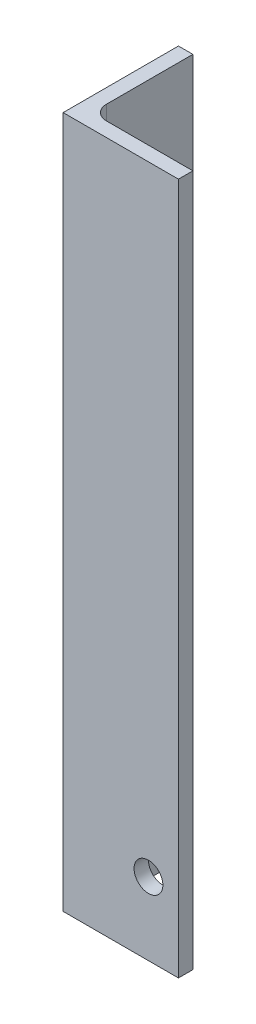
ISO-10303-21;
HEADER;
FILE_DESCRIPTION(('STEP AP214'),'2;1');
FILE_NAME('part.step','',(''),(''),'','','');
FILE_SCHEMA(('AUTOMOTIVE_DESIGN { 1 0 10303 214 1 1 1 1 }'));
ENDSEC;
DATA;
#1=APPLICATION_CONTEXT('core data for automotive mechanical design processes');
#2=APPLICATION_PROTOCOL_DEFINITION('international standard','automotive_design',2000,#1);
#3=PRODUCT_CONTEXT('',#1,'mechanical');
#4=PRODUCT('Part','Part','',(#3));
#5=PRODUCT_RELATED_PRODUCT_CATEGORY('part','',(#4));
#6=PRODUCT_DEFINITION_FORMATION('','',#4);
#7=PRODUCT_DEFINITION_CONTEXT('part definition',#1,'design');
#8=PRODUCT_DEFINITION('design','',#6,#7);
#9=PRODUCT_DEFINITION_SHAPE('','',#8);
#10=(LENGTH_UNIT() NAMED_UNIT(*) SI_UNIT(.MILLI.,.METRE.));
#11=(NAMED_UNIT(*) PLANE_ANGLE_UNIT() SI_UNIT($,.RADIAN.));
#12=(NAMED_UNIT(*) SI_UNIT($,.STERADIAN.) SOLID_ANGLE_UNIT());
#13=UNCERTAINTY_MEASURE_WITH_UNIT(LENGTH_MEASURE(1.E-05),#10,'distance_accuracy_value','');
#14=(GEOMETRIC_REPRESENTATION_CONTEXT(3) GLOBAL_UNCERTAINTY_ASSIGNED_CONTEXT((#13)) GLOBAL_UNIT_ASSIGNED_CONTEXT((#10,
#11,#12)) REPRESENTATION_CONTEXT('',''));
#15=CARTESIAN_POINT('',(0.,0.,0.));
#16=DIRECTION('',(0.,0.,1.));
#17=DIRECTION('',(1.,0.,0.));
#18=AXIS2_PLACEMENT_3D('',#15,#16,#17);
#19=CARTESIAN_POINT('',(3.175,152.4,0.));
#20=DIRECTION('',(0.,0.,1.));
#21=DIRECTION('',(1.,0.,0.));
#22=AXIS2_PLACEMENT_3D('',#19,#20,#21);
#23=PLANE('',#22);
#24=DIRECTION('',(-1.,0.,0.));
#25=VECTOR('',#24,1.);
#26=CARTESIAN_POINT('',(3.175,0.,0.));
#27=LINE('',#26,#25);
#28=CARTESIAN_POINT('',(3.175,0.,0.));
#29=VERTEX_POINT('',#28);
#30=CARTESIAN_POINT('',(0.,0.,0.));
#31=VERTEX_POINT('',#30);
#32=EDGE_CURVE('E122',#29,#31,#27,.T.);
#33=ORIENTED_EDGE('',*,*,#32,.T.);
#34=DIRECTION('',(0.,-1.,0.));
#35=VECTOR('',#34,1.);
#36=CARTESIAN_POINT('',(0.,152.4,0.));
#37=LINE('',#36,#35);
#38=CARTESIAN_POINT('',(0.,152.4,0.));
#39=VERTEX_POINT('',#38);
#40=EDGE_CURVE('E103',#39,#31,#37,.T.);
#41=ORIENTED_EDGE('',*,*,#40,.F.);
#42=DIRECTION('',(-1.,0.,0.));
#43=VECTOR('',#42,1.);
#44=CARTESIAN_POINT('',(3.175,152.4,0.));
#45=LINE('',#44,#43);
#46=CARTESIAN_POINT('',(3.175,152.4,0.));
#47=VERTEX_POINT('',#46);
#48=EDGE_CURVE('E110',#47,#39,#45,.T.);
#49=ORIENTED_EDGE('',*,*,#48,.F.);
#50=DIRECTION('',(0.,-1.,0.));
#51=VECTOR('',#50,1.);
#52=CARTESIAN_POINT('',(3.175,152.4,0.));
#53=LINE('',#52,#51);
#54=EDGE_CURVE('E137',#47,#29,#53,.T.);
#55=ORIENTED_EDGE('',*,*,#54,.T.);
#56=EDGE_LOOP('',(#33,#41,#49,#55));
#57=FACE_BOUND('',#56,.T.);
#58=ADVANCED_FACE('F39',(#57),#23,.F.);
#59=CARTESIAN_POINT('',(0.,152.4,0.));
#60=DIRECTION('',(1.,0.,0.));
#61=DIRECTION('',(0.,0.,-1.));
#62=AXIS2_PLACEMENT_3D('',#59,#60,#61);
#63=PLANE('',#62);
#64=CARTESIAN_POINT('',(0.,15.875,6.60400000000002));
#65=DIRECTION('',(-1.,0.,0.));
#66=DIRECTION('',(0.,0.,1.));
#67=AXIS2_PLACEMENT_3D('',#64,#65,#66);
#68=CIRCLE('',#67,3.175);
#69=CARTESIAN_POINT('',(0.,15.875,9.77900000000002));
#70=VERTEX_POINT('',#69);
#71=EDGE_CURVE('E155',#70,#70,#68,.T.);
#72=ORIENTED_EDGE('',*,*,#71,.F.);
#73=EDGE_LOOP('',(#72));
#74=FACE_BOUND('',#73,.T.);
#75=DIRECTION('',(0.,0.,1.));
#76=VECTOR('',#75,1.);
#77=CARTESIAN_POINT('',(0.,0.,0.));
#78=LINE('',#77,#76);
#79=CARTESIAN_POINT('',(0.,0.,25.4));
#80=VERTEX_POINT('',#79);
#81=EDGE_CURVE('E146',#31,#80,#78,.T.);
#82=ORIENTED_EDGE('',*,*,#81,.T.);
#83=DIRECTION('',(0.,-1.,0.));
#84=VECTOR('',#83,1.);
#85=CARTESIAN_POINT('',(0.,152.4,25.4));
#86=LINE('',#85,#84);
#87=CARTESIAN_POINT('',(0.,152.4,25.4));
#88=VERTEX_POINT('',#87);
#89=EDGE_CURVE('E106',#88,#80,#86,.T.);
#90=ORIENTED_EDGE('',*,*,#89,.F.);
#91=DIRECTION('',(0.,0.,1.));
#92=VECTOR('',#91,1.);
#93=CARTESIAN_POINT('',(0.,152.4,0.));
#94=LINE('',#93,#92);
#95=EDGE_CURVE('E99',#39,#88,#94,.T.);
#96=ORIENTED_EDGE('',*,*,#95,.F.);
#97=ORIENTED_EDGE('',*,*,#40,.T.);
#98=EDGE_LOOP('',(#82,#90,#96,#97));
#99=FACE_BOUND('',#98,.T.);
#100=ADVANCED_FACE('F101',(#74,#99),#63,.F.);
#101=CARTESIAN_POINT('',(0.,152.4,25.4));
#102=DIRECTION('',(0.,0.,-1.));
#103=DIRECTION('',(-1.,0.,0.));
#104=AXIS2_PLACEMENT_3D('',#101,#102,#103);
#105=PLANE('',#104);
#106=CARTESIAN_POINT('',(18.796,16.002,25.4));
#107=DIRECTION('',(0.,0.,1.));
#108=DIRECTION('',(1.,0.,0.));
#109=AXIS2_PLACEMENT_3D('',#106,#107,#108);
#110=CIRCLE('',#109,3.175);
#111=CARTESIAN_POINT('',(21.971,16.002,25.4));
#112=VERTEX_POINT('',#111);
#113=EDGE_CURVE('E161',#112,#112,#110,.T.);
#114=ORIENTED_EDGE('',*,*,#113,.F.);
#115=EDGE_LOOP('',(#114));
#116=FACE_BOUND('',#115,.T.);
#117=DIRECTION('',(1.,0.,0.));
#118=VECTOR('',#117,1.);
#119=CARTESIAN_POINT('',(0.,0.,25.4));
#120=LINE('',#119,#118);
#121=CARTESIAN_POINT('',(25.4,0.,25.4));
#122=VERTEX_POINT('',#121);
#123=EDGE_CURVE('E144',#80,#122,#120,.T.);
#124=ORIENTED_EDGE('',*,*,#123,.T.);
#125=DIRECTION('',(0.,-1.,0.));
#126=VECTOR('',#125,1.);
#127=CARTESIAN_POINT('',(25.4,152.4,25.4));
#128=LINE('',#127,#126);
#129=CARTESIAN_POINT('',(25.4,152.4,25.4));
#130=VERTEX_POINT('',#129);
#131=EDGE_CURVE('E127',#130,#122,#128,.T.);
#132=ORIENTED_EDGE('',*,*,#131,.F.);
#133=DIRECTION('',(1.,0.,0.));
#134=VECTOR('',#133,1.);
#135=CARTESIAN_POINT('',(0.,152.4,25.4));
#136=LINE('',#135,#134);
#137=EDGE_CURVE('E109',#88,#130,#136,.T.);
#138=ORIENTED_EDGE('',*,*,#137,.F.);
#139=ORIENTED_EDGE('',*,*,#89,.T.);
#140=EDGE_LOOP('',(#124,#132,#138,#139));
#141=FACE_BOUND('',#140,.T.);
#142=ADVANCED_FACE('F168',(#116,#141),#105,.F.);
#143=CARTESIAN_POINT('',(25.4,152.4,25.4));
#144=DIRECTION('',(-1.,0.,0.));
#145=DIRECTION('',(0.,0.,1.));
#146=AXIS2_PLACEMENT_3D('',#143,#144,#145);
#147=PLANE('',#146);
#148=DIRECTION('',(0.,0.,-1.));
#149=VECTOR('',#148,1.);
#150=CARTESIAN_POINT('',(25.4,0.,25.4));
#151=LINE('',#150,#149);
#152=CARTESIAN_POINT('',(25.4,0.,22.225));
#153=VERTEX_POINT('',#152);
#154=EDGE_CURVE('E142',#122,#153,#151,.T.);
#155=ORIENTED_EDGE('',*,*,#154,.T.);
#156=DIRECTION('',(0.,-1.,0.));
#157=VECTOR('',#156,1.);
#158=CARTESIAN_POINT('',(25.4,152.4,22.225));
#159=LINE('',#158,#157);
#160=CARTESIAN_POINT('',(25.4,152.4,22.225));
#161=VERTEX_POINT('',#160);
#162=EDGE_CURVE('E134',#161,#153,#159,.T.);
#163=ORIENTED_EDGE('',*,*,#162,.F.);
#164=DIRECTION('',(0.,0.,-1.));
#165=VECTOR('',#164,1.);
#166=CARTESIAN_POINT('',(25.4,152.4,25.4));
#167=LINE('',#166,#165);
#168=EDGE_CURVE('E152',#130,#161,#167,.T.);
#169=ORIENTED_EDGE('',*,*,#168,.F.);
#170=ORIENTED_EDGE('',*,*,#131,.T.);
#171=EDGE_LOOP('',(#155,#163,#169,#170));
#172=FACE_BOUND('',#171,.T.);
#173=ADVANCED_FACE('F171',(#172),#147,.F.);
#174=CARTESIAN_POINT('',(25.4,152.4,22.225));
#175=DIRECTION('',(0.,0.,1.));
#176=DIRECTION('',(1.,0.,0.));
#177=AXIS2_PLACEMENT_3D('',#174,#175,#176);
#178=PLANE('',#177);
#179=CARTESIAN_POINT('',(18.796,16.002,22.225));
#180=DIRECTION('',(0.,0.,1.));
#181=DIRECTION('',(1.,0.,0.));
#182=AXIS2_PLACEMENT_3D('',#179,#180,#181);
#183=CIRCLE('',#182,3.175);
#184=CARTESIAN_POINT('',(21.971,16.002,22.225));
#185=VERTEX_POINT('',#184);
#186=EDGE_CURVE('E158',#185,#185,#183,.F.);
#187=ORIENTED_EDGE('',*,*,#186,.F.);
#188=EDGE_LOOP('',(#187));
#189=FACE_BOUND('',#188,.T.);
#190=DIRECTION('',(-1.,0.,0.));
#191=VECTOR('',#190,1.);
#192=CARTESIAN_POINT('',(25.4,0.,22.225));
#193=LINE('',#192,#191);
#194=CARTESIAN_POINT('',(6.35,0.,22.225));
#195=VERTEX_POINT('',#194);
#196=EDGE_CURVE('E140',#153,#195,#193,.T.);
#197=ORIENTED_EDGE('',*,*,#196,.T.);
#198=DIRECTION('',(0.,-1.,0.));
#199=VECTOR('',#198,1.);
#200=CARTESIAN_POINT('',(6.35,152.4,22.225));
#201=LINE('',#200,#199);
#202=CARTESIAN_POINT('',(6.35,152.4,22.225));
#203=VERTEX_POINT('',#202);
#204=EDGE_CURVE('E55',#195,#203,#201,.F.);
#205=ORIENTED_EDGE('',*,*,#204,.T.);
#206=DIRECTION('',(-1.,0.,0.));
#207=VECTOR('',#206,1.);
#208=CARTESIAN_POINT('',(25.4,152.4,22.225));
#209=LINE('',#208,#207);
#210=EDGE_CURVE('E150',#161,#203,#209,.T.);
#211=ORIENTED_EDGE('',*,*,#210,.F.);
#212=ORIENTED_EDGE('',*,*,#162,.T.);
#213=EDGE_LOOP('',(#197,#205,#211,#212));
#214=FACE_BOUND('',#213,.T.);
#215=ADVANCED_FACE('F180',(#189,#214),#178,.F.);
#216=CARTESIAN_POINT('',(3.175,152.4,22.225));
#217=DIRECTION('',(-1.,0.,0.));
#218=DIRECTION('',(0.,0.,1.));
#219=AXIS2_PLACEMENT_3D('',#216,#217,#218);
#220=PLANE('',#219);
#221=CARTESIAN_POINT('',(3.175,15.875,6.60400000000002));
#222=DIRECTION('',(-1.,0.,0.));
#223=DIRECTION('',(0.,0.,1.));
#224=AXIS2_PLACEMENT_3D('',#221,#222,#223);
#225=CIRCLE('',#224,3.175);
#226=CARTESIAN_POINT('',(3.175,15.875,9.77900000000002));
#227=VERTEX_POINT('',#226);
#228=EDGE_CURVE('E43',#227,#227,#225,.T.);
#229=ORIENTED_EDGE('',*,*,#228,.T.);
#230=EDGE_LOOP('',(#229));
#231=FACE_BOUND('',#230,.T.);
#232=DIRECTION('',(0.,0.,-1.));
#233=VECTOR('',#232,1.);
#234=CARTESIAN_POINT('',(3.175,152.4,22.225));
#235=LINE('',#234,#233);
#236=CARTESIAN_POINT('',(3.175,152.4,19.05));
#237=VERTEX_POINT('',#236);
#238=EDGE_CURVE('E115',#237,#47,#235,.T.);
#239=ORIENTED_EDGE('',*,*,#238,.F.);
#240=DIRECTION('',(0.,-1.,0.));
#241=VECTOR('',#240,1.);
#242=CARTESIAN_POINT('',(3.175,0.,19.05));
#243=LINE('',#242,#241);
#244=CARTESIAN_POINT('',(3.175,0.,19.05));
#245=VERTEX_POINT('',#244);
#246=EDGE_CURVE('E123',#237,#245,#243,.T.);
#247=ORIENTED_EDGE('',*,*,#246,.T.);
#248=DIRECTION('',(0.,0.,-1.));
#249=VECTOR('',#248,1.);
#250=CARTESIAN_POINT('',(3.175,0.,22.225));
#251=LINE('',#250,#249);
#252=EDGE_CURVE('E119',#245,#29,#251,.T.);
#253=ORIENTED_EDGE('',*,*,#252,.T.);
#254=ORIENTED_EDGE('',*,*,#54,.F.);
#255=EDGE_LOOP('',(#239,#247,#253,#254));
#256=FACE_BOUND('',#255,.T.);
#257=ADVANCED_FACE('F185',(#231,#256),#220,.F.);
#258=CARTESIAN_POINT('',(0.,152.4,0.));
#259=DIRECTION('',(0.,1.,0.));
#260=DIRECTION('',(0.,0.,1.));
#261=AXIS2_PLACEMENT_3D('',#258,#259,#260);
#262=PLANE('',#261);
#263=ORIENTED_EDGE('',*,*,#48,.T.);
#264=ORIENTED_EDGE('',*,*,#95,.T.);
#265=ORIENTED_EDGE('',*,*,#137,.T.);
#266=ORIENTED_EDGE('',*,*,#168,.T.);
#267=ORIENTED_EDGE('',*,*,#210,.T.);
#268=CARTESIAN_POINT('',(6.35,152.4,19.05));
#269=DIRECTION('',(0.,1.,0.));
#270=DIRECTION('',(0.,0.,1.));
#271=AXIS2_PLACEMENT_3D('',#268,#269,#270);
#272=CIRCLE('',#271,3.175);
#273=EDGE_CURVE('E11',#203,#237,#272,.F.);
#274=ORIENTED_EDGE('',*,*,#273,.T.);
#275=ORIENTED_EDGE('',*,*,#238,.T.);
#276=EDGE_LOOP('',(#263,#264,#265,#266,#267,#274,#275));
#277=FACE_BOUND('',#276,.T.);
#278=ADVANCED_FACE('F113',(#277),#262,.T.);
#279=CARTESIAN_POINT('',(0.,0.,0.));
#280=DIRECTION('',(0.,1.,0.));
#281=DIRECTION('',(0.,0.,1.));
#282=AXIS2_PLACEMENT_3D('',#279,#280,#281);
#283=PLANE('',#282);
#284=ORIENTED_EDGE('',*,*,#32,.F.);
#285=ORIENTED_EDGE('',*,*,#252,.F.);
#286=CARTESIAN_POINT('',(6.35,0.,19.05));
#287=DIRECTION('',(0.,1.,0.));
#288=DIRECTION('',(0.,0.,1.));
#289=AXIS2_PLACEMENT_3D('',#286,#287,#288);
#290=CIRCLE('',#289,3.175);
#291=EDGE_CURVE('E48',#245,#195,#290,.T.);
#292=ORIENTED_EDGE('',*,*,#291,.T.);
#293=ORIENTED_EDGE('',*,*,#196,.F.);
#294=ORIENTED_EDGE('',*,*,#154,.F.);
#295=ORIENTED_EDGE('',*,*,#123,.F.);
#296=ORIENTED_EDGE('',*,*,#81,.F.);
#297=EDGE_LOOP('',(#284,#285,#292,#293,#294,#295,#296));
#298=FACE_BOUND('',#297,.T.);
#299=ADVANCED_FACE('F179',(#298),#283,.F.);
#300=CARTESIAN_POINT('',(6.35,152.4,19.05));
#301=DIRECTION('',(0.,1.,0.));
#302=DIRECTION('',(0.,0.,1.));
#303=AXIS2_PLACEMENT_3D('',#300,#301,#302);
#304=CYLINDRICAL_SURFACE('',#303,3.175);
#305=ORIENTED_EDGE('',*,*,#273,.F.);
#306=ORIENTED_EDGE('',*,*,#204,.F.);
#307=ORIENTED_EDGE('',*,*,#291,.F.);
#308=ORIENTED_EDGE('',*,*,#246,.F.);
#309=EDGE_LOOP('',(#305,#306,#307,#308));
#310=FACE_BOUND('',#309,.T.);
#311=ADVANCED_FACE('F41',(#310),#304,.F.);
#312=CARTESIAN_POINT('',(25.4,15.875,6.60400000000002));
#313=DIRECTION('',(-1.,0.,0.));
#314=DIRECTION('',(0.,0.,1.));
#315=AXIS2_PLACEMENT_3D('',#312,#313,#314);
#316=CYLINDRICAL_SURFACE('',#315,3.175);
#317=CARTESIAN_POINT('',(0.,15.875,9.77900000000002));
#318=CARTESIAN_POINT('',(0.0330729166666671,15.875,9.77900000000002));
#319=CARTESIAN_POINT('',(0.0661458333333342,15.875,9.77900000000002));
#320=CARTESIAN_POINT('',(0.132291666666667,15.875,9.77900000000002));
#321=CARTESIAN_POINT('',(0.165364583333333,15.875,9.77900000000002));
#322=CARTESIAN_POINT('',(0.231510416666666,15.875,9.77900000000002));
#323=CARTESIAN_POINT('',(0.264583333333333,15.875,9.77900000000002));
#324=CARTESIAN_POINT('',(0.330729166666667,15.875,9.77900000000002));
#325=CARTESIAN_POINT('',(0.363802083333334,15.875,9.77900000000002));
#326=CARTESIAN_POINT('',(0.429947916666667,15.875,9.77900000000002));
#327=CARTESIAN_POINT('',(0.463020833333333,15.875,9.77900000000002));
#328=CARTESIAN_POINT('',(0.529166666666666,15.875,9.77900000000002));
#329=CARTESIAN_POINT('',(0.562239583333333,15.875,9.77900000000002));
#330=CARTESIAN_POINT('',(0.628385416666667,15.875,9.77900000000002));
#331=CARTESIAN_POINT('',(0.661458333333334,15.875,9.77900000000002));
#332=CARTESIAN_POINT('',(0.727604166666669,15.875,9.77900000000002));
#333=CARTESIAN_POINT('',(0.760677083333336,15.875,9.77900000000002));
#334=CARTESIAN_POINT('',(0.826822916666669,15.875,9.77900000000002));
#335=CARTESIAN_POINT('',(0.859895833333335,15.875,9.77900000000002));
#336=CARTESIAN_POINT('',(0.926041666666668,15.875,9.77900000000002));
#337=CARTESIAN_POINT('',(0.959114583333335,15.875,9.77900000000002));
#338=CARTESIAN_POINT('',(1.02526041666667,15.875,9.77900000000002));
#339=CARTESIAN_POINT('',(1.05833333333334,15.875,9.77900000000002));
#340=CARTESIAN_POINT('',(1.12447916666667,15.875,9.77900000000002));
#341=CARTESIAN_POINT('',(1.15755208333333,15.875,9.77900000000002));
#342=CARTESIAN_POINT('',(1.22369791666667,15.875,9.77900000000002));
#343=CARTESIAN_POINT('',(1.25677083333333,15.875,9.77900000000002));
#344=CARTESIAN_POINT('',(1.32291666666667,15.875,9.77900000000002));
#345=CARTESIAN_POINT('',(1.35598958333334,15.875,9.77900000000002));
#346=CARTESIAN_POINT('',(1.42213541666667,15.875,9.77900000000002));
#347=CARTESIAN_POINT('',(1.45520833333333,15.875,9.77900000000002));
#348=CARTESIAN_POINT('',(1.52135416666667,15.875,9.77900000000002));
#349=CARTESIAN_POINT('',(1.55442708333333,15.875,9.77900000000002));
#350=CARTESIAN_POINT('',(1.62057291666667,15.875,9.77900000000002));
#351=CARTESIAN_POINT('',(1.65364583333334,15.875,9.77900000000002));
#352=CARTESIAN_POINT('',(1.71979166666667,15.875,9.77900000000002));
#353=CARTESIAN_POINT('',(1.75286458333334,15.875,9.77900000000002));
#354=CARTESIAN_POINT('',(1.81901041666667,15.875,9.77900000000002));
#355=CARTESIAN_POINT('',(1.85208333333334,15.875,9.77900000000002));
#356=CARTESIAN_POINT('',(1.91822916666667,15.875,9.77900000000002));
#357=CARTESIAN_POINT('',(1.95130208333334,15.875,9.77900000000002));
#358=CARTESIAN_POINT('',(2.01744791666667,15.875,9.77900000000002));
#359=CARTESIAN_POINT('',(2.05052083333334,15.875,9.77900000000002));
#360=CARTESIAN_POINT('',(2.11666666666667,15.875,9.77900000000002));
#361=CARTESIAN_POINT('',(2.14973958333334,15.875,9.77900000000002));
#362=CARTESIAN_POINT('',(2.21588541666667,15.875,9.77900000000002));
#363=CARTESIAN_POINT('',(2.24895833333334,15.875,9.77900000000002));
#364=CARTESIAN_POINT('',(2.31510416666667,15.875,9.77900000000002));
#365=CARTESIAN_POINT('',(2.34817708333334,15.875,9.77900000000002));
#366=CARTESIAN_POINT('',(2.41432291666667,15.875,9.77900000000002));
#367=CARTESIAN_POINT('',(2.44739583333334,15.875,9.77900000000002));
#368=CARTESIAN_POINT('',(2.51354166666667,15.875,9.77900000000002));
#369=CARTESIAN_POINT('',(2.54661458333334,15.875,9.77900000000002));
#370=CARTESIAN_POINT('',(2.61276041666667,15.875,9.77900000000002));
#371=CARTESIAN_POINT('',(2.64583333333334,15.875,9.77900000000002));
#372=CARTESIAN_POINT('',(2.71197916666667,15.875,9.77900000000002));
#373=CARTESIAN_POINT('',(2.74505208333334,15.875,9.77900000000002));
#374=CARTESIAN_POINT('',(2.81119791666667,15.875,9.77900000000002));
#375=CARTESIAN_POINT('',(2.84427083333334,15.875,9.77900000000002));
#376=CARTESIAN_POINT('',(2.91041666666667,15.875,9.77900000000002));
#377=CARTESIAN_POINT('',(2.94348958333334,15.875,9.77900000000002));
#378=CARTESIAN_POINT('',(3.00963541666667,15.875,9.77900000000002));
#379=CARTESIAN_POINT('',(3.04270833333334,15.875,9.77900000000002));
#380=CARTESIAN_POINT('',(3.10885416666667,15.875,9.77900000000002));
#381=CARTESIAN_POINT('',(3.14192708333334,15.875,9.77900000000002));
#382=CARTESIAN_POINT('',(3.175,15.875,9.77900000000002));
#383=B_SPLINE_CURVE_WITH_KNOTS('',3,(#317,#318,#319,#320,#321,#322,#323,#324,#325,#326,#327,
#328,#329,#330,#331,#332,#333,#334,#335,#336,#337,#338,#339,#340,#341,#342,#343,#344,#345,#346,
#347,#348,#349,#350,#351,#352,#353,#354,#355,#356,#357,#358,#359,#360,#361,#362,#363,#364,#365,
#366,#367,#368,#369,#370,#371,#372,#373,#374,#375,#376,#377,#378,#379,#380,#381,#382),
.UNSPECIFIED.,.F.,.F.,(4,2,2,2,2,2,2,2,2,2,2,2,2,2,2,2,2,2,2,2,2,2,2,2,2,2,2,2,2,2,2,2,4),(0.,
0.0992187500000012,0.198437499999999,0.29765625,0.396875000000001,0.496093749999999,0.5953125,
0.694531250000002,0.793750000000003,0.892968750000001,0.992187500000002,1.09140625,1.190625,
1.28984375,1.3890625,1.48828125,1.5875,1.68671875,1.7859375,1.88515625,1.984375,2.08359375,
2.1828125,2.28203125,2.38125,2.48046875,2.5796875,2.67890625,2.778125,2.87734375,
2.97656250000001,3.07578125,3.175),.UNSPECIFIED.);
#384=EDGE_CURVE('BSEAM225',#70,#227,#383,.T.);
#385=ORIENTED_EDGE('',*,*,#71,.T.);
#386=ORIENTED_EDGE('',*,*,#228,.F.);
#387=ORIENTED_EDGE('',*,*,#384,.T.);
#388=ORIENTED_EDGE('',*,*,#384,.F.);
#389=EDGE_LOOP('',(#385,#387,#386,#388));
#390=FACE_BOUND('',#389,.T.);
#391=ADVANCED_FACE('F225',(#390),#316,.F.);
#392=CARTESIAN_POINT('',(18.796,16.002,-0.001000000000001));
#393=DIRECTION('',(0.,0.,1.));
#394=DIRECTION('',(1.,0.,0.));
#395=AXIS2_PLACEMENT_3D('',#392,#393,#394);
#396=CYLINDRICAL_SURFACE('',#395,3.175);
#397=CARTESIAN_POINT('',(21.971,16.002,25.4));
#398=CARTESIAN_POINT('',(21.971,16.002,25.3669270833333));
#399=CARTESIAN_POINT('',(21.971,16.002,25.3338541666667));
#400=CARTESIAN_POINT('',(21.971,16.002,25.2677083333333));
#401=CARTESIAN_POINT('',(21.971,16.002,25.2346354166667));
#402=CARTESIAN_POINT('',(21.971,16.002,25.1684895833333));
#403=CARTESIAN_POINT('',(21.971,16.002,25.1354166666667));
#404=CARTESIAN_POINT('',(21.971,16.002,25.0692708333333));
#405=CARTESIAN_POINT('',(21.971,16.002,25.0361979166667));
#406=CARTESIAN_POINT('',(21.971,16.002,24.9700520833333));
#407=CARTESIAN_POINT('',(21.971,16.002,24.9369791666667));
#408=CARTESIAN_POINT('',(21.971,16.002,24.8708333333333));
#409=CARTESIAN_POINT('',(21.971,16.002,24.8377604166667));
#410=CARTESIAN_POINT('',(21.971,16.002,24.7716145833333));
#411=CARTESIAN_POINT('',(21.971,16.002,24.7385416666667));
#412=CARTESIAN_POINT('',(21.971,16.002,24.6723958333333));
#413=CARTESIAN_POINT('',(21.971,16.002,24.6393229166667));
#414=CARTESIAN_POINT('',(21.971,16.002,24.5731770833333));
#415=CARTESIAN_POINT('',(21.971,16.002,24.5401041666667));
#416=CARTESIAN_POINT('',(21.971,16.002,24.4739583333333));
#417=CARTESIAN_POINT('',(21.971,16.002,24.4408854166667));
#418=CARTESIAN_POINT('',(21.971,16.002,24.3747395833333));
#419=CARTESIAN_POINT('',(21.971,16.002,24.3416666666667));
#420=CARTESIAN_POINT('',(21.971,16.002,24.2755208333333));
#421=CARTESIAN_POINT('',(21.971,16.002,24.2424479166667));
#422=CARTESIAN_POINT('',(21.971,16.002,24.1763020833333));
#423=CARTESIAN_POINT('',(21.971,16.002,24.1432291666667));
#424=CARTESIAN_POINT('',(21.971,16.002,24.0770833333333));
#425=CARTESIAN_POINT('',(21.971,16.002,24.0440104166667));
#426=CARTESIAN_POINT('',(21.971,16.002,23.9778645833333));
#427=CARTESIAN_POINT('',(21.971,16.002,23.9447916666667));
#428=CARTESIAN_POINT('',(21.971,16.002,23.8786458333333));
#429=CARTESIAN_POINT('',(21.971,16.002,23.8455729166667));
#430=CARTESIAN_POINT('',(21.971,16.002,23.7794270833333));
#431=CARTESIAN_POINT('',(21.971,16.002,23.7463541666667));
#432=CARTESIAN_POINT('',(21.971,16.002,23.6802083333333));
#433=CARTESIAN_POINT('',(21.971,16.002,23.6471354166667));
#434=CARTESIAN_POINT('',(21.971,16.002,23.5809895833333));
#435=CARTESIAN_POINT('',(21.971,16.002,23.5479166666667));
#436=CARTESIAN_POINT('',(21.971,16.002,23.4817708333333));
#437=CARTESIAN_POINT('',(21.971,16.002,23.4486979166667));
#438=CARTESIAN_POINT('',(21.971,16.002,23.3825520833333));
#439=CARTESIAN_POINT('',(21.971,16.002,23.3494791666667));
#440=CARTESIAN_POINT('',(21.971,16.002,23.2833333333333));
#441=CARTESIAN_POINT('',(21.971,16.002,23.2502604166667));
#442=CARTESIAN_POINT('',(21.971,16.002,23.1841145833333));
#443=CARTESIAN_POINT('',(21.971,16.002,23.1510416666667));
#444=CARTESIAN_POINT('',(21.971,16.002,23.0848958333333));
#445=CARTESIAN_POINT('',(21.971,16.002,23.0518229166667));
#446=CARTESIAN_POINT('',(21.971,16.002,22.9856770833333));
#447=CARTESIAN_POINT('',(21.971,16.002,22.9526041666667));
#448=CARTESIAN_POINT('',(21.971,16.002,22.8864583333333));
#449=CARTESIAN_POINT('',(21.971,16.002,22.8533854166667));
#450=CARTESIAN_POINT('',(21.971,16.002,22.7872395833333));
#451=CARTESIAN_POINT('',(21.971,16.002,22.7541666666667));
#452=CARTESIAN_POINT('',(21.971,16.002,22.6880208333333));
#453=CARTESIAN_POINT('',(21.971,16.002,22.6549479166667));
#454=CARTESIAN_POINT('',(21.971,16.002,22.5888020833333));
#455=CARTESIAN_POINT('',(21.971,16.002,22.5557291666667));
#456=CARTESIAN_POINT('',(21.971,16.002,22.4895833333333));
#457=CARTESIAN_POINT('',(21.971,16.002,22.4565104166667));
#458=CARTESIAN_POINT('',(21.971,16.002,22.3903645833333));
#459=CARTESIAN_POINT('',(21.971,16.002,22.3572916666667));
#460=CARTESIAN_POINT('',(21.971,16.002,22.2911458333333));
#461=CARTESIAN_POINT('',(21.971,16.002,22.2580729166667));
#462=CARTESIAN_POINT('',(21.971,16.002,22.225));
#463=B_SPLINE_CURVE_WITH_KNOTS('',3,(#397,#398,#399,#400,#401,#402,#403,#404,#405,#406,#407,
#408,#409,#410,#411,#412,#413,#414,#415,#416,#417,#418,#419,#420,#421,#422,#423,#424,#425,#426,
#427,#428,#429,#430,#431,#432,#433,#434,#435,#436,#437,#438,#439,#440,#441,#442,#443,#444,#445,
#446,#447,#448,#449,#450,#451,#452,#453,#454,#455,#456,#457,#458,#459,#460,#461,#462),
.UNSPECIFIED.,.F.,.F.,(4,2,2,2,2,2,2,2,2,2,2,2,2,2,2,2,2,2,2,2,2,2,2,2,2,2,2,2,2,2,2,2,4),(0.,
0.0992187500000012,0.198437499999999,0.29765625,0.396875000000001,0.496093749999999,0.5953125,
0.694531250000002,0.793750000000003,0.892968750000001,0.992187500000002,1.09140625,1.190625,
1.28984375,1.3890625,1.48828125,1.5875,1.68671875,1.7859375,1.88515625,1.984375,2.08359375,
2.1828125,2.28203125,2.38125,2.48046875,2.5796875,2.67890625,2.778125,2.87734375,
2.97656250000001,3.07578125,3.175),.UNSPECIFIED.);
#464=EDGE_CURVE('BSEAM165',#112,#185,#463,.T.);
#465=ORIENTED_EDGE('',*,*,#113,.T.);
#466=ORIENTED_EDGE('',*,*,#186,.T.);
#467=ORIENTED_EDGE('',*,*,#464,.T.);
#468=ORIENTED_EDGE('',*,*,#464,.F.);
#469=EDGE_LOOP('',(#465,#467,#466,#468));
#470=FACE_BOUND('',#469,.T.);
#471=ADVANCED_FACE('F165',(#470),#396,.F.);
#472=CLOSED_SHELL('',(#58,#100,#142,#173,#215,#257,#278,#299,#311,#391,#471));
#473=MANIFOLD_SOLID_BREP('B2',#472);
#474=ADVANCED_BREP_SHAPE_REPRESENTATION('',(#18,#473),#14);
#475=SHAPE_DEFINITION_REPRESENTATION(#9,#474);
ENDSEC;
END-ISO-10303-21;
